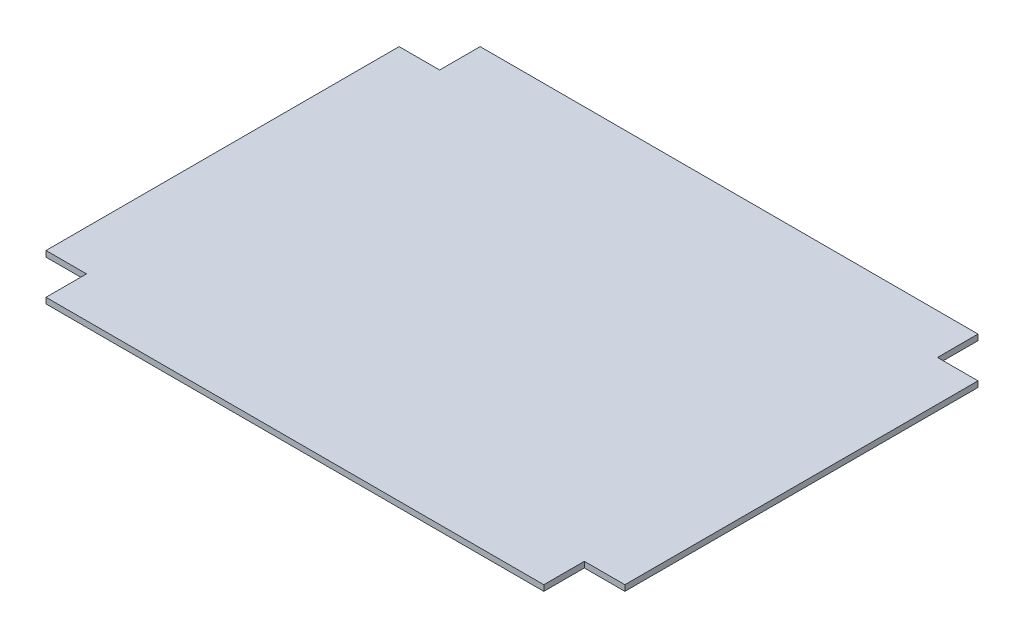
ISO-10303-21;
HEADER;
FILE_DESCRIPTION(('STEP AP214'),'2;1');
FILE_NAME('part.step','',(''),(''),'','','');
FILE_SCHEMA(('AUTOMOTIVE_DESIGN { 1 0 10303 214 1 1 1 1 }'));
ENDSEC;
DATA;
#1=APPLICATION_CONTEXT('core data for automotive mechanical design processes');
#2=APPLICATION_PROTOCOL_DEFINITION('international standard','automotive_design',2000,#1);
#3=PRODUCT_CONTEXT('',#1,'mechanical');
#4=PRODUCT('Part','Part','',(#3));
#5=PRODUCT_RELATED_PRODUCT_CATEGORY('part','',(#4));
#6=PRODUCT_DEFINITION_FORMATION('','',#4);
#7=PRODUCT_DEFINITION_CONTEXT('part definition',#1,'design');
#8=PRODUCT_DEFINITION('design','',#6,#7);
#9=PRODUCT_DEFINITION_SHAPE('','',#8);
#10=(LENGTH_UNIT() NAMED_UNIT(*) SI_UNIT(.MILLI.,.METRE.));
#11=(NAMED_UNIT(*) PLANE_ANGLE_UNIT() SI_UNIT($,.RADIAN.));
#12=(NAMED_UNIT(*) SI_UNIT($,.STERADIAN.) SOLID_ANGLE_UNIT());
#13=UNCERTAINTY_MEASURE_WITH_UNIT(LENGTH_MEASURE(1.E-05),#10,'distance_accuracy_value','');
#14=(GEOMETRIC_REPRESENTATION_CONTEXT(3) GLOBAL_UNCERTAINTY_ASSIGNED_CONTEXT((#13)) GLOBAL_UNIT_ASSIGNED_CONTEXT((#10,
#11,#12)) REPRESENTATION_CONTEXT('',''));
#15=CARTESIAN_POINT('',(0.,0.,0.));
#16=DIRECTION('',(0.,0.,1.));
#17=DIRECTION('',(1.,0.,0.));
#18=AXIS2_PLACEMENT_3D('',#15,#16,#17);
#19=CARTESIAN_POINT('',(-930.069787982878,6.,220.623802890493));
#20=DIRECTION('',(0.,0.,1.));
#21=DIRECTION('',(1.,0.,0.));
#22=AXIS2_PLACEMENT_3D('',#19,#20,#21);
#23=PLANE('',#22);
#24=DIRECTION('',(-1.,0.,0.));
#25=VECTOR('',#24,1.);
#26=CARTESIAN_POINT('',(-930.069787982878,0.,220.623802890493));
#27=LINE('',#26,#25);
#28=CARTESIAN_POINT('',(-930.069787982878,0.,220.623802890493));
#29=VERTEX_POINT('',#28);
#30=CARTESIAN_POINT('',(-1446.06978798288,0.,220.623802890493));
#31=VERTEX_POINT('',#30);
#32=EDGE_CURVE('E153',#29,#31,#27,.T.);
#33=ORIENTED_EDGE('',*,*,#32,.T.);
#34=DIRECTION('',(0.,-1.,0.));
#35=VECTOR('',#34,1.);
#36=CARTESIAN_POINT('',(-1446.06978798288,6.,220.623802890493));
#37=LINE('',#36,#35);
#38=CARTESIAN_POINT('',(-1446.06978798288,6.,220.623802890493));
#39=VERTEX_POINT('',#38);
#40=EDGE_CURVE('E11',#39,#31,#37,.T.);
#41=ORIENTED_EDGE('',*,*,#40,.F.);
#42=DIRECTION('',(-1.,0.,0.));
#43=VECTOR('',#42,1.);
#44=CARTESIAN_POINT('',(-930.069787982878,6.,220.623802890493));
#45=LINE('',#44,#43);
#46=CARTESIAN_POINT('',(-930.069787982878,6.,220.623802890493));
#47=VERTEX_POINT('',#46);
#48=EDGE_CURVE('E175',#47,#39,#45,.T.);
#49=ORIENTED_EDGE('',*,*,#48,.F.);
#50=DIRECTION('',(0.,-1.,0.));
#51=VECTOR('',#50,1.);
#52=CARTESIAN_POINT('',(-930.069787982878,6.,220.623802890493));
#53=LINE('',#52,#51);
#54=EDGE_CURVE('E149',#47,#29,#53,.T.);
#55=ORIENTED_EDGE('',*,*,#54,.T.);
#56=EDGE_LOOP('',(#33,#41,#49,#55));
#57=FACE_BOUND('',#56,.T.);
#58=ADVANCED_FACE('F33',(#57),#23,.F.);
#59=CARTESIAN_POINT('',(-1446.06978798288,6.,220.623802890493));
#60=DIRECTION('',(1.,0.,0.));
#61=DIRECTION('',(0.,0.,-1.));
#62=AXIS2_PLACEMENT_3D('',#59,#60,#61);
#63=PLANE('',#62);
#64=DIRECTION('',(0.,0.,1.));
#65=VECTOR('',#64,1.);
#66=CARTESIAN_POINT('',(-1446.06978798288,0.,220.623802890493));
#67=LINE('',#66,#65);
#68=CARTESIAN_POINT('',(-1446.06978798288,0.,262.623802890493));
#69=VERTEX_POINT('',#68);
#70=EDGE_CURVE('E156',#31,#69,#67,.T.);
#71=ORIENTED_EDGE('',*,*,#70,.T.);
#72=DIRECTION('',(0.,-1.,0.));
#73=VECTOR('',#72,1.);
#74=CARTESIAN_POINT('',(-1446.06978798288,6.,262.623802890493));
#75=LINE('',#74,#73);
#76=CARTESIAN_POINT('',(-1446.06978798288,6.,262.623802890493));
#77=VERTEX_POINT('',#76);
#78=EDGE_CURVE('E41',#77,#69,#75,.T.);
#79=ORIENTED_EDGE('',*,*,#78,.F.);
#80=DIRECTION('',(0.,0.,1.));
#81=VECTOR('',#80,1.);
#82=CARTESIAN_POINT('',(-1446.06978798288,6.,220.623802890493));
#83=LINE('',#82,#81);
#84=EDGE_CURVE('E104',#39,#77,#83,.T.);
#85=ORIENTED_EDGE('',*,*,#84,.F.);
#86=ORIENTED_EDGE('',*,*,#40,.T.);
#87=EDGE_LOOP('',(#71,#79,#85,#86));
#88=FACE_BOUND('',#87,.T.);
#89=ADVANCED_FACE('F253',(#88),#63,.F.);
#90=CARTESIAN_POINT('',(-1446.06978798288,6.,262.623802890493));
#91=DIRECTION('',(0.,0.,1.));
#92=DIRECTION('',(1.,0.,0.));
#93=AXIS2_PLACEMENT_3D('',#90,#91,#92);
#94=PLANE('',#93);
#95=DIRECTION('',(-1.,0.,0.));
#96=VECTOR('',#95,1.);
#97=CARTESIAN_POINT('',(-1446.06978798288,0.,262.623802890493));
#98=LINE('',#97,#96);
#99=CARTESIAN_POINT('',(-1488.06978798288,0.,262.623802890493));
#100=VERTEX_POINT('',#99);
#101=EDGE_CURVE('E158',#69,#100,#98,.T.);
#102=ORIENTED_EDGE('',*,*,#101,.T.);
#103=DIRECTION('',(0.,-1.,0.));
#104=VECTOR('',#103,1.);
#105=CARTESIAN_POINT('',(-1488.06978798288,6.,262.623802890493));
#106=LINE('',#105,#104);
#107=CARTESIAN_POINT('',(-1488.06978798288,6.,262.623802890493));
#108=VERTEX_POINT('',#107);
#109=EDGE_CURVE('E194',#108,#100,#106,.T.);
#110=ORIENTED_EDGE('',*,*,#109,.F.);
#111=DIRECTION('',(-1.,0.,0.));
#112=VECTOR('',#111,1.);
#113=CARTESIAN_POINT('',(-1446.06978798288,6.,262.623802890493));
#114=LINE('',#113,#112);
#115=EDGE_CURVE('E202',#77,#108,#114,.T.);
#116=ORIENTED_EDGE('',*,*,#115,.F.);
#117=ORIENTED_EDGE('',*,*,#78,.T.);
#118=EDGE_LOOP('',(#102,#110,#116,#117));
#119=FACE_BOUND('',#118,.T.);
#120=ADVANCED_FACE('F200',(#119),#94,.F.);
#121=CARTESIAN_POINT('',(-1488.06978798288,6.,262.623802890493));
#122=DIRECTION('',(1.,0.,0.));
#123=DIRECTION('',(0.,0.,-1.));
#124=AXIS2_PLACEMENT_3D('',#121,#122,#123);
#125=PLANE('',#124);
#126=DIRECTION('',(0.,0.,1.));
#127=VECTOR('',#126,1.);
#128=CARTESIAN_POINT('',(-1488.06978798288,0.,262.623802890493));
#129=LINE('',#128,#127);
#130=CARTESIAN_POINT('',(-1488.06978798288,0.,628.623802890493));
#131=VERTEX_POINT('',#130);
#132=EDGE_CURVE('E160',#100,#131,#129,.T.);
#133=ORIENTED_EDGE('',*,*,#132,.T.);
#134=DIRECTION('',(0.,-1.,0.));
#135=VECTOR('',#134,1.);
#136=CARTESIAN_POINT('',(-1488.06978798288,6.,628.623802890493));
#137=LINE('',#136,#135);
#138=CARTESIAN_POINT('',(-1488.06978798288,6.,628.623802890493));
#139=VERTEX_POINT('',#138);
#140=EDGE_CURVE('E191',#139,#131,#137,.T.);
#141=ORIENTED_EDGE('',*,*,#140,.F.);
#142=DIRECTION('',(0.,0.,1.));
#143=VECTOR('',#142,1.);
#144=CARTESIAN_POINT('',(-1488.06978798288,6.,262.623802890493));
#145=LINE('',#144,#143);
#146=EDGE_CURVE('E220',#108,#139,#145,.T.);
#147=ORIENTED_EDGE('',*,*,#146,.F.);
#148=ORIENTED_EDGE('',*,*,#109,.T.);
#149=EDGE_LOOP('',(#133,#141,#147,#148));
#150=FACE_BOUND('',#149,.T.);
#151=ADVANCED_FACE('F211',(#150),#125,.F.);
#152=CARTESIAN_POINT('',(-1488.06978798288,6.,628.623802890493));
#153=DIRECTION('',(0.,0.,-1.));
#154=DIRECTION('',(-1.,0.,0.));
#155=AXIS2_PLACEMENT_3D('',#152,#153,#154);
#156=PLANE('',#155);
#157=DIRECTION('',(1.,0.,0.));
#158=VECTOR('',#157,1.);
#159=CARTESIAN_POINT('',(-1488.06978798288,0.,628.623802890493));
#160=LINE('',#159,#158);
#161=CARTESIAN_POINT('',(-1446.06978798288,0.,628.623802890493));
#162=VERTEX_POINT('',#161);
#163=EDGE_CURVE('E162',#131,#162,#160,.T.);
#164=ORIENTED_EDGE('',*,*,#163,.T.);
#165=DIRECTION('',(0.,-1.,0.));
#166=VECTOR('',#165,1.);
#167=CARTESIAN_POINT('',(-1446.06978798288,6.,628.623802890493));
#168=LINE('',#167,#166);
#169=CARTESIAN_POINT('',(-1446.06978798288,6.,628.623802890493));
#170=VERTEX_POINT('',#169);
#171=EDGE_CURVE('E188',#170,#162,#168,.T.);
#172=ORIENTED_EDGE('',*,*,#171,.F.);
#173=DIRECTION('',(1.,0.,0.));
#174=VECTOR('',#173,1.);
#175=CARTESIAN_POINT('',(-1488.06978798288,6.,628.623802890493));
#176=LINE('',#175,#174);
#177=EDGE_CURVE('E217',#139,#170,#176,.T.);
#178=ORIENTED_EDGE('',*,*,#177,.F.);
#179=ORIENTED_EDGE('',*,*,#140,.T.);
#180=EDGE_LOOP('',(#164,#172,#178,#179));
#181=FACE_BOUND('',#180,.T.);
#182=ADVANCED_FACE('F215',(#181),#156,.F.);
#183=CARTESIAN_POINT('',(-1446.06978798288,6.,628.623802890493));
#184=DIRECTION('',(1.,0.,0.));
#185=DIRECTION('',(0.,0.,-1.));
#186=AXIS2_PLACEMENT_3D('',#183,#184,#185);
#187=PLANE('',#186);
#188=DIRECTION('',(0.,0.,1.));
#189=VECTOR('',#188,1.);
#190=CARTESIAN_POINT('',(-1446.06978798288,0.,628.623802890493));
#191=LINE('',#190,#189);
#192=CARTESIAN_POINT('',(-1446.06978798288,0.,670.623802890493));
#193=VERTEX_POINT('',#192);
#194=EDGE_CURVE('E164',#162,#193,#191,.T.);
#195=ORIENTED_EDGE('',*,*,#194,.T.);
#196=DIRECTION('',(0.,-1.,0.));
#197=VECTOR('',#196,1.);
#198=CARTESIAN_POINT('',(-1446.06978798288,6.,670.623802890493));
#199=LINE('',#198,#197);
#200=CARTESIAN_POINT('',(-1446.06978798288,6.,670.623802890493));
#201=VERTEX_POINT('',#200);
#202=EDGE_CURVE('E185',#201,#193,#199,.T.);
#203=ORIENTED_EDGE('',*,*,#202,.F.);
#204=DIRECTION('',(0.,0.,1.));
#205=VECTOR('',#204,1.);
#206=CARTESIAN_POINT('',(-1446.06978798288,6.,628.623802890493));
#207=LINE('',#206,#205);
#208=EDGE_CURVE('E219',#170,#201,#207,.T.);
#209=ORIENTED_EDGE('',*,*,#208,.F.);
#210=ORIENTED_EDGE('',*,*,#171,.T.);
#211=EDGE_LOOP('',(#195,#203,#209,#210));
#212=FACE_BOUND('',#211,.T.);
#213=ADVANCED_FACE('F266',(#212),#187,.F.);
#214=CARTESIAN_POINT('',(-930.069787982878,6.,670.623802890493));
#215=DIRECTION('',(0.,0.,-1.));
#216=DIRECTION('',(-1.,0.,0.));
#217=AXIS2_PLACEMENT_3D('',#214,#215,#216);
#218=PLANE('',#217);
#219=DIRECTION('',(1.,0.,0.));
#220=VECTOR('',#219,1.);
#221=CARTESIAN_POINT('',(-930.069787982878,0.,670.623802890493));
#222=LINE('',#221,#220);
#223=CARTESIAN_POINT('',(-930.069787982878,0.,670.623802890493));
#224=VERTEX_POINT('',#223);
#225=EDGE_CURVE('E166',#193,#224,#222,.T.);
#226=ORIENTED_EDGE('',*,*,#225,.T.);
#227=DIRECTION('',(0.,-1.,0.));
#228=VECTOR('',#227,1.);
#229=CARTESIAN_POINT('',(-930.069787982878,6.,670.623802890493));
#230=LINE('',#229,#228);
#231=CARTESIAN_POINT('',(-930.069787982878,6.,670.623802890493));
#232=VERTEX_POINT('',#231);
#233=EDGE_CURVE('E182',#232,#224,#230,.T.);
#234=ORIENTED_EDGE('',*,*,#233,.F.);
#235=DIRECTION('',(1.,0.,0.));
#236=VECTOR('',#235,1.);
#237=CARTESIAN_POINT('',(-930.069787982878,6.,670.623802890493));
#238=LINE('',#237,#236);
#239=EDGE_CURVE('E222',#201,#232,#238,.T.);
#240=ORIENTED_EDGE('',*,*,#239,.F.);
#241=ORIENTED_EDGE('',*,*,#202,.T.);
#242=EDGE_LOOP('',(#226,#234,#240,#241));
#243=FACE_BOUND('',#242,.T.);
#244=ADVANCED_FACE('F269',(#243),#218,.F.);
#245=CARTESIAN_POINT('',(-930.069787982878,6.,628.623802890493));
#246=DIRECTION('',(-1.,0.,0.));
#247=DIRECTION('',(0.,0.,1.));
#248=AXIS2_PLACEMENT_3D('',#245,#246,#247);
#249=PLANE('',#248);
#250=DIRECTION('',(0.,0.,-1.));
#251=VECTOR('',#250,1.);
#252=CARTESIAN_POINT('',(-930.069787982878,0.,628.623802890493));
#253=LINE('',#252,#251);
#254=CARTESIAN_POINT('',(-930.069787982878,0.,628.623802890493));
#255=VERTEX_POINT('',#254);
#256=EDGE_CURVE('E168',#224,#255,#253,.T.);
#257=ORIENTED_EDGE('',*,*,#256,.T.);
#258=DIRECTION('',(0.,-1.,0.));
#259=VECTOR('',#258,1.);
#260=CARTESIAN_POINT('',(-930.069787982878,6.,628.623802890493));
#261=LINE('',#260,#259);
#262=CARTESIAN_POINT('',(-930.069787982878,6.,628.623802890493));
#263=VERTEX_POINT('',#262);
#264=EDGE_CURVE('E179',#263,#255,#261,.T.);
#265=ORIENTED_EDGE('',*,*,#264,.F.);
#266=DIRECTION('',(0.,0.,-1.));
#267=VECTOR('',#266,1.);
#268=CARTESIAN_POINT('',(-930.069787982878,6.,628.623802890493));
#269=LINE('',#268,#267);
#270=EDGE_CURVE('E228',#232,#263,#269,.T.);
#271=ORIENTED_EDGE('',*,*,#270,.F.);
#272=ORIENTED_EDGE('',*,*,#233,.T.);
#273=EDGE_LOOP('',(#257,#265,#271,#272));
#274=FACE_BOUND('',#273,.T.);
#275=ADVANCED_FACE('F234',(#274),#249,.F.);
#276=CARTESIAN_POINT('',(-888.069787982878,6.,628.623802890493));
#277=DIRECTION('',(0.,0.,-1.));
#278=DIRECTION('',(-1.,0.,0.));
#279=AXIS2_PLACEMENT_3D('',#276,#277,#278);
#280=PLANE('',#279);
#281=DIRECTION('',(1.,0.,0.));
#282=VECTOR('',#281,1.);
#283=CARTESIAN_POINT('',(-888.069787982878,0.,628.623802890493));
#284=LINE('',#283,#282);
#285=CARTESIAN_POINT('',(-888.069787982878,0.,628.623802890493));
#286=VERTEX_POINT('',#285);
#287=EDGE_CURVE('E170',#255,#286,#284,.T.);
#288=ORIENTED_EDGE('',*,*,#287,.T.);
#289=DIRECTION('',(0.,-1.,0.));
#290=VECTOR('',#289,1.);
#291=CARTESIAN_POINT('',(-888.069787982878,6.,628.623802890493));
#292=LINE('',#291,#290);
#293=CARTESIAN_POINT('',(-888.069787982878,6.,628.623802890493));
#294=VERTEX_POINT('',#293);
#295=EDGE_CURVE('E144',#294,#286,#292,.T.);
#296=ORIENTED_EDGE('',*,*,#295,.F.);
#297=DIRECTION('',(1.,0.,0.));
#298=VECTOR('',#297,1.);
#299=CARTESIAN_POINT('',(-888.069787982878,6.,628.623802890493));
#300=LINE('',#299,#298);
#301=EDGE_CURVE('E135',#263,#294,#300,.T.);
#302=ORIENTED_EDGE('',*,*,#301,.F.);
#303=ORIENTED_EDGE('',*,*,#264,.T.);
#304=EDGE_LOOP('',(#288,#296,#302,#303));
#305=FACE_BOUND('',#304,.T.);
#306=ADVANCED_FACE('F238',(#305),#280,.F.);
#307=CARTESIAN_POINT('',(-888.069787982878,6.,262.623802890493));
#308=DIRECTION('',(-1.,0.,0.));
#309=DIRECTION('',(0.,0.,1.));
#310=AXIS2_PLACEMENT_3D('',#307,#308,#309);
#311=PLANE('',#310);
#312=DIRECTION('',(0.,0.,-1.));
#313=VECTOR('',#312,1.);
#314=CARTESIAN_POINT('',(-888.069787982878,0.,262.623802890493));
#315=LINE('',#314,#313);
#316=CARTESIAN_POINT('',(-888.069787982878,0.,262.623802890493));
#317=VERTEX_POINT('',#316);
#318=EDGE_CURVE('E143',#286,#317,#315,.T.);
#319=ORIENTED_EDGE('',*,*,#318,.T.);
#320=DIRECTION('',(0.,-1.,0.));
#321=VECTOR('',#320,1.);
#322=CARTESIAN_POINT('',(-888.069787982878,6.,262.623802890493));
#323=LINE('',#322,#321);
#324=CARTESIAN_POINT('',(-888.069787982878,6.,262.623802890493));
#325=VERTEX_POINT('',#324);
#326=EDGE_CURVE('E140',#325,#317,#323,.T.);
#327=ORIENTED_EDGE('',*,*,#326,.F.);
#328=DIRECTION('',(0.,0.,-1.));
#329=VECTOR('',#328,1.);
#330=CARTESIAN_POINT('',(-888.069787982878,6.,262.623802890493));
#331=LINE('',#330,#329);
#332=EDGE_CURVE('E129',#294,#325,#331,.T.);
#333=ORIENTED_EDGE('',*,*,#332,.F.);
#334=ORIENTED_EDGE('',*,*,#295,.T.);
#335=EDGE_LOOP('',(#319,#327,#333,#334));
#336=FACE_BOUND('',#335,.T.);
#337=ADVANCED_FACE('F141',(#336),#311,.F.);
#338=CARTESIAN_POINT('',(-930.069787982878,6.,262.623802890493));
#339=DIRECTION('',(0.,0.,1.));
#340=DIRECTION('',(1.,0.,0.));
#341=AXIS2_PLACEMENT_3D('',#338,#339,#340);
#342=PLANE('',#341);
#343=DIRECTION('',(-1.,0.,0.));
#344=VECTOR('',#343,1.);
#345=CARTESIAN_POINT('',(-930.069787982878,0.,262.623802890493));
#346=LINE('',#345,#344);
#347=CARTESIAN_POINT('',(-930.069787982878,0.,262.623802890493));
#348=VERTEX_POINT('',#347);
#349=EDGE_CURVE('E90',#317,#348,#346,.T.);
#350=ORIENTED_EDGE('',*,*,#349,.T.);
#351=DIRECTION('',(0.,-1.,0.));
#352=VECTOR('',#351,1.);
#353=CARTESIAN_POINT('',(-930.069787982878,6.,262.623802890493));
#354=LINE('',#353,#352);
#355=CARTESIAN_POINT('',(-930.069787982878,6.,262.623802890493));
#356=VERTEX_POINT('',#355);
#357=EDGE_CURVE('E145',#356,#348,#354,.T.);
#358=ORIENTED_EDGE('',*,*,#357,.F.);
#359=DIRECTION('',(-1.,0.,0.));
#360=VECTOR('',#359,1.);
#361=CARTESIAN_POINT('',(-930.069787982878,6.,262.623802890493));
#362=LINE('',#361,#360);
#363=EDGE_CURVE('E133',#325,#356,#362,.T.);
#364=ORIENTED_EDGE('',*,*,#363,.F.);
#365=ORIENTED_EDGE('',*,*,#326,.T.);
#366=EDGE_LOOP('',(#350,#358,#364,#365));
#367=FACE_BOUND('',#366,.T.);
#368=ADVANCED_FACE('F147',(#367),#342,.F.);
#369=CARTESIAN_POINT('',(-930.069787982878,6.,220.623802890493));
#370=DIRECTION('',(-1.,0.,0.));
#371=DIRECTION('',(0.,0.,1.));
#372=AXIS2_PLACEMENT_3D('',#369,#370,#371);
#373=PLANE('',#372);
#374=DIRECTION('',(0.,0.,-1.));
#375=VECTOR('',#374,1.);
#376=CARTESIAN_POINT('',(-930.069787982878,0.,220.623802890493));
#377=LINE('',#376,#375);
#378=EDGE_CURVE('E96',#348,#29,#377,.T.);
#379=ORIENTED_EDGE('',*,*,#378,.T.);
#380=ORIENTED_EDGE('',*,*,#54,.F.);
#381=DIRECTION('',(0.,0.,-1.));
#382=VECTOR('',#381,1.);
#383=CARTESIAN_POINT('',(-930.069787982878,6.,220.623802890493));
#384=LINE('',#383,#382);
#385=EDGE_CURVE('E49',#356,#47,#384,.T.);
#386=ORIENTED_EDGE('',*,*,#385,.F.);
#387=ORIENTED_EDGE('',*,*,#357,.T.);
#388=EDGE_LOOP('',(#379,#380,#386,#387));
#389=FACE_BOUND('',#388,.T.);
#390=ADVANCED_FACE('F242',(#389),#373,.F.);
#391=CARTESIAN_POINT('',(0.,6.,0.));
#392=DIRECTION('',(0.,1.,0.));
#393=DIRECTION('',(0.,0.,1.));
#394=AXIS2_PLACEMENT_3D('',#391,#392,#393);
#395=PLANE('',#394);
#396=ORIENTED_EDGE('',*,*,#48,.T.);
#397=ORIENTED_EDGE('',*,*,#84,.T.);
#398=ORIENTED_EDGE('',*,*,#115,.T.);
#399=ORIENTED_EDGE('',*,*,#146,.T.);
#400=ORIENTED_EDGE('',*,*,#177,.T.);
#401=ORIENTED_EDGE('',*,*,#208,.T.);
#402=ORIENTED_EDGE('',*,*,#239,.T.);
#403=ORIENTED_EDGE('',*,*,#270,.T.);
#404=ORIENTED_EDGE('',*,*,#301,.T.);
#405=ORIENTED_EDGE('',*,*,#332,.T.);
#406=ORIENTED_EDGE('',*,*,#363,.T.);
#407=ORIENTED_EDGE('',*,*,#385,.T.);
#408=EDGE_LOOP('',(#396,#397,#398,#399,#400,#401,#402,#403,#404,#405,#406,#407));
#409=FACE_BOUND('',#408,.T.);
#410=ADVANCED_FACE('F131',(#409),#395,.T.);
#411=CARTESIAN_POINT('',(0.,0.,0.));
#412=DIRECTION('',(0.,1.,0.));
#413=DIRECTION('',(0.,0.,1.));
#414=AXIS2_PLACEMENT_3D('',#411,#412,#413);
#415=PLANE('',#414);
#416=ORIENTED_EDGE('',*,*,#32,.F.);
#417=ORIENTED_EDGE('',*,*,#378,.F.);
#418=ORIENTED_EDGE('',*,*,#349,.F.);
#419=ORIENTED_EDGE('',*,*,#318,.F.);
#420=ORIENTED_EDGE('',*,*,#287,.F.);
#421=ORIENTED_EDGE('',*,*,#256,.F.);
#422=ORIENTED_EDGE('',*,*,#225,.F.);
#423=ORIENTED_EDGE('',*,*,#194,.F.);
#424=ORIENTED_EDGE('',*,*,#163,.F.);
#425=ORIENTED_EDGE('',*,*,#132,.F.);
#426=ORIENTED_EDGE('',*,*,#101,.F.);
#427=ORIENTED_EDGE('',*,*,#70,.F.);
#428=EDGE_LOOP('',(#416,#417,#418,#419,#420,#421,#422,#423,#424,#425,#426,#427));
#429=FACE_BOUND('',#428,.T.);
#430=ADVANCED_FACE('F206',(#429),#415,.F.);
#431=CLOSED_SHELL('',(#58,#89,#120,#151,#182,#213,#244,#275,#306,#337,#368,#390,#410,#430));
#432=MANIFOLD_SOLID_BREP('B2',#431);
#433=ADVANCED_BREP_SHAPE_REPRESENTATION('',(#18,#432),#14);
#434=SHAPE_DEFINITION_REPRESENTATION(#9,#433);
ENDSEC;
END-ISO-10303-21;
